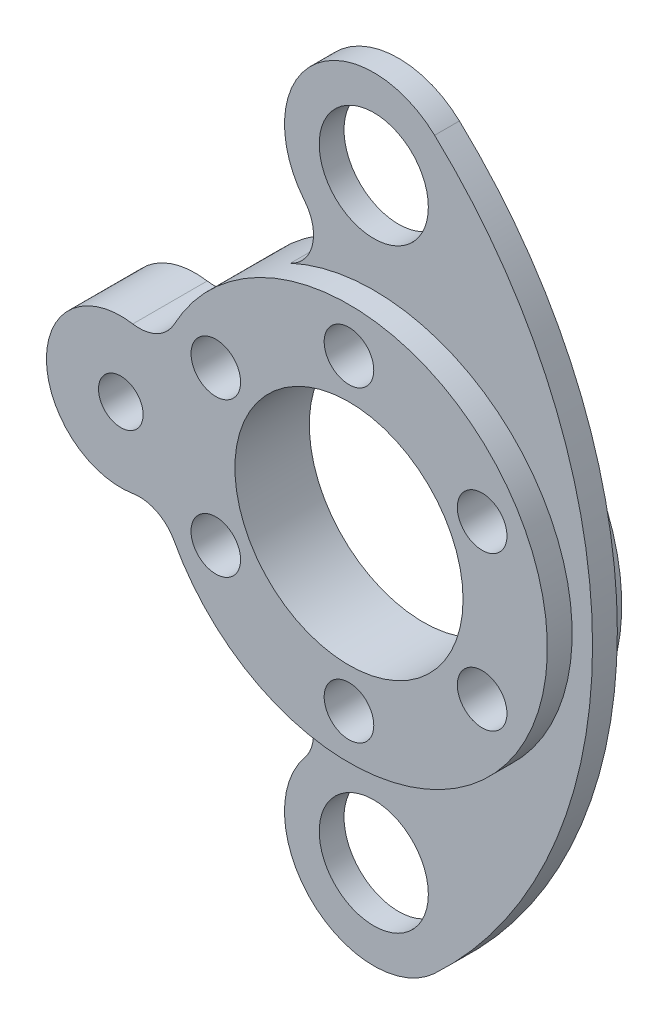
ISO-10303-21;
HEADER;
FILE_DESCRIPTION(('STEP AP214'),'2;1');
FILE_NAME('part.step','',(''),(''),'','','');
FILE_SCHEMA(('AUTOMOTIVE_DESIGN { 1 0 10303 214 1 1 1 1 }'));
ENDSEC;
DATA;
#1=APPLICATION_CONTEXT('core data for automotive mechanical design processes');
#2=APPLICATION_PROTOCOL_DEFINITION('international standard','automotive_design',2000,#1);
#3=PRODUCT_CONTEXT('',#1,'mechanical');
#4=PRODUCT('Part','Part','',(#3));
#5=PRODUCT_RELATED_PRODUCT_CATEGORY('part','',(#4));
#6=PRODUCT_DEFINITION_FORMATION('','',#4);
#7=PRODUCT_DEFINITION_CONTEXT('part definition',#1,'design');
#8=PRODUCT_DEFINITION('design','',#6,#7);
#9=PRODUCT_DEFINITION_SHAPE('','',#8);
#10=(LENGTH_UNIT() NAMED_UNIT(*) SI_UNIT(.MILLI.,.METRE.));
#11=(NAMED_UNIT(*) PLANE_ANGLE_UNIT() SI_UNIT($,.RADIAN.));
#12=(NAMED_UNIT(*) SI_UNIT($,.STERADIAN.) SOLID_ANGLE_UNIT());
#13=UNCERTAINTY_MEASURE_WITH_UNIT(LENGTH_MEASURE(1.E-05),#10,'distance_accuracy_value','');
#14=(GEOMETRIC_REPRESENTATION_CONTEXT(3) GLOBAL_UNCERTAINTY_ASSIGNED_CONTEXT((#13)) GLOBAL_UNIT_ASSIGNED_CONTEXT((#10,
#11,#12)) REPRESENTATION_CONTEXT('',''));
#15=CARTESIAN_POINT('',(0.,0.,0.));
#16=DIRECTION('',(0.,0.,1.));
#17=DIRECTION('',(1.,0.,0.));
#18=AXIS2_PLACEMENT_3D('',#15,#16,#17);
#19=CARTESIAN_POINT('',(-46.,0.,-15.));
#20=DIRECTION('',(0.,0.,1.));
#21=DIRECTION('',(1.,0.,0.));
#22=AXIS2_PLACEMENT_3D('',#19,#20,#21);
#23=CYLINDRICAL_SURFACE('',#22,15.);
#24=CARTESIAN_POINT('',(-46.,0.,0.));
#25=DIRECTION('',(0.,0.,1.));
#26=DIRECTION('',(1.,0.,0.));
#27=AXIS2_PLACEMENT_3D('',#24,#25,#26);
#28=CIRCLE('',#27,15.);
#29=CARTESIAN_POINT('',(-43.5827032136106,14.8039412403086,0.));
#30=VERTEX_POINT('',#29);
#31=CARTESIAN_POINT('',(-43.5827032136106,-14.8039412403086,0.));
#32=VERTEX_POINT('',#31);
#33=EDGE_CURVE('E242',#30,#32,#28,.T.);
#34=ORIENTED_EDGE('',*,*,#33,.F.);
#35=DIRECTION('',(0.,0.,1.));
#36=VECTOR('',#35,1.);
#37=CARTESIAN_POINT('',(-43.5827032136106,14.8039412403086,-15.));
#38=LINE('',#37,#36);
#39=CARTESIAN_POINT('',(-43.5827032136106,14.8039412403086,-15.));
#40=VERTEX_POINT('',#39);
#41=EDGE_CURVE('E11',#40,#30,#38,.T.);
#42=ORIENTED_EDGE('',*,*,#41,.F.);
#43=CARTESIAN_POINT('',(-46.,0.,-15.));
#44=DIRECTION('',(0.,0.,1.));
#45=DIRECTION('',(1.,0.,0.));
#46=AXIS2_PLACEMENT_3D('',#43,#44,#45);
#47=CIRCLE('',#46,15.);
#48=CARTESIAN_POINT('',(-43.5827032136106,-14.8039412403086,-15.));
#49=VERTEX_POINT('',#48);
#50=EDGE_CURVE('E211',#40,#49,#47,.T.);
#51=ORIENTED_EDGE('',*,*,#50,.T.);
#52=DIRECTION('',(0.,0.,1.));
#53=VECTOR('',#52,1.);
#54=CARTESIAN_POINT('',(-43.5827032136106,-14.8039412403086,-15.));
#55=LINE('',#54,#53);
#56=EDGE_CURVE('E43',#49,#32,#55,.T.);
#57=ORIENTED_EDGE('',*,*,#56,.T.);
#58=EDGE_LOOP('',(#34,#42,#51,#57));
#59=FACE_BOUND('',#58,.T.);
#60=ADVANCED_FACE('F39',(#59),#23,.T.);
#61=CARTESIAN_POINT('',(-42.2934782608696,22.6993765684733,-15.));
#62=DIRECTION('',(0.,0.,1.));
#63=DIRECTION('',(1.,0.,0.));
#64=AXIS2_PLACEMENT_3D('',#61,#62,#63);
#65=CYLINDRICAL_SURFACE('',#64,8.);
#66=CARTESIAN_POINT('',(-42.2934782608696,22.6993765684733,0.));
#67=DIRECTION('',(0.,0.,1.));
#68=DIRECTION('',(1.,0.,0.));
#69=AXIS2_PLACEMENT_3D('',#66,#67,#68);
#70=CIRCLE('',#69,8.);
#71=CARTESIAN_POINT('',(-35.2445652173913,18.9161471403944,0.));
#72=VERTEX_POINT('',#71);
#73=EDGE_CURVE('E251',#30,#72,#70,.T.);
#74=ORIENTED_EDGE('',*,*,#73,.T.);
#75=DIRECTION('',(0.,0.,1.));
#76=VECTOR('',#75,1.);
#77=CARTESIAN_POINT('',(-35.2445652173913,18.9161471403944,-15.));
#78=LINE('',#77,#76);
#79=CARTESIAN_POINT('',(-35.2445652173913,18.9161471403944,-15.));
#80=VERTEX_POINT('',#79);
#81=EDGE_CURVE('E48',#80,#72,#78,.T.);
#82=ORIENTED_EDGE('',*,*,#81,.F.);
#83=CARTESIAN_POINT('',(-42.2934782608696,22.6993765684733,-15.));
#84=DIRECTION('',(0.,0.,1.));
#85=DIRECTION('',(1.,0.,0.));
#86=AXIS2_PLACEMENT_3D('',#83,#84,#85);
#87=CIRCLE('',#86,8.);
#88=EDGE_CURVE('E217',#40,#80,#87,.T.);
#89=ORIENTED_EDGE('',*,*,#88,.F.);
#90=ORIENTED_EDGE('',*,*,#41,.T.);
#91=EDGE_LOOP('',(#74,#82,#89,#90));
#92=FACE_BOUND('',#91,.T.);
#93=ADVANCED_FACE('F270',(#92),#65,.F.);
#94=CARTESIAN_POINT('',(0.,0.,-15.));
#95=DIRECTION('',(0.,0.,1.));
#96=DIRECTION('',(1.,0.,0.));
#97=AXIS2_PLACEMENT_3D('',#94,#95,#96);
#98=CYLINDRICAL_SURFACE('',#97,40.);
#99=CARTESIAN_POINT('',(0.,0.,-5.));
#100=DIRECTION('',(0.,0.,1.));
#101=DIRECTION('',(1.,0.,0.));
#102=AXIS2_PLACEMENT_3D('',#99,#100,#101);
#103=CIRCLE('',#102,40.);
#104=CARTESIAN_POINT('',(-16.7900755150914,-36.3055555555556,-5.));
#105=VERTEX_POINT('',#104);
#106=CARTESIAN_POINT('',(-16.7900755150914,36.3055555555556,-5.));
#107=VERTEX_POINT('',#106);
#108=EDGE_CURVE('E148',#105,#107,#103,.T.);
#109=ORIENTED_EDGE('',*,*,#108,.T.);
#110=DIRECTION('',(0.,0.,-1.));
#111=VECTOR('',#110,1.);
#112=CARTESIAN_POINT('',(-16.7900755150914,36.3055555555556,-5.));
#113=LINE('',#112,#111);
#114=CARTESIAN_POINT('',(-16.7900755150914,36.3055555555556,-10.));
#115=VERTEX_POINT('',#114);
#116=EDGE_CURVE('E186',#107,#115,#113,.T.);
#117=ORIENTED_EDGE('',*,*,#116,.T.);
#118=CARTESIAN_POINT('',(0.,0.,-10.));
#119=DIRECTION('',(0.,0.,1.));
#120=DIRECTION('',(1.,0.,0.));
#121=AXIS2_PLACEMENT_3D('',#118,#119,#120);
#122=CIRCLE('',#121,40.);
#123=CARTESIAN_POINT('',(-16.7900755150914,-36.3055555555556,-10.));
#124=VERTEX_POINT('',#123);
#125=EDGE_CURVE('E181',#124,#115,#122,.T.);
#126=ORIENTED_EDGE('',*,*,#125,.F.);
#127=DIRECTION('',(0.,0.,-1.));
#128=VECTOR('',#127,1.);
#129=CARTESIAN_POINT('',(-16.7900755150914,-36.3055555555556,-5.));
#130=LINE('',#129,#128);
#131=EDGE_CURVE('E169',#105,#124,#130,.T.);
#132=ORIENTED_EDGE('',*,*,#131,.F.);
#133=EDGE_LOOP('',(#109,#117,#126,#132));
#134=FACE_BOUND('',#133,.T.);
#135=CARTESIAN_POINT('',(0.,0.,0.));
#136=DIRECTION('',(0.,0.,1.));
#137=DIRECTION('',(1.,0.,0.));
#138=AXIS2_PLACEMENT_3D('',#135,#136,#137);
#139=CIRCLE('',#138,40.);
#140=CARTESIAN_POINT('',(-35.2445652173913,-18.9161471403944,0.));
#141=VERTEX_POINT('',#140);
#142=EDGE_CURVE('E248',#141,#72,#139,.T.);
#143=ORIENTED_EDGE('',*,*,#142,.F.);
#144=DIRECTION('',(0.,0.,1.));
#145=VECTOR('',#144,1.);
#146=CARTESIAN_POINT('',(-35.2445652173913,-18.9161471403944,-15.));
#147=LINE('',#146,#145);
#148=CARTESIAN_POINT('',(-35.2445652173913,-18.9161471403944,-15.));
#149=VERTEX_POINT('',#148);
#150=EDGE_CURVE('E261',#149,#141,#147,.T.);
#151=ORIENTED_EDGE('',*,*,#150,.F.);
#152=CARTESIAN_POINT('',(0.,0.,-15.));
#153=DIRECTION('',(0.,0.,1.));
#154=DIRECTION('',(1.,0.,0.));
#155=AXIS2_PLACEMENT_3D('',#152,#153,#154);
#156=CIRCLE('',#155,40.);
#157=EDGE_CURVE('E214',#149,#80,#156,.T.);
#158=ORIENTED_EDGE('',*,*,#157,.T.);
#159=ORIENTED_EDGE('',*,*,#81,.T.);
#160=EDGE_LOOP('',(#143,#151,#158,#159));
#161=FACE_BOUND('',#160,.T.);
#162=ADVANCED_FACE('F272',(#134,#161),#98,.T.);
#163=CARTESIAN_POINT('',(0.,31.,-15.));
#164=DIRECTION('',(0.,0.,1.));
#165=DIRECTION('',(1.,0.,0.));
#166=AXIS2_PLACEMENT_3D('',#163,#164,#165);
#167=CYLINDRICAL_SURFACE('',#166,5.);
#168=CARTESIAN_POINT('',(0.,31.,-15.));
#169=DIRECTION('',(0.,0.,1.));
#170=DIRECTION('',(1.,0.,0.));
#171=AXIS2_PLACEMENT_3D('',#168,#169,#170);
#172=CIRCLE('',#171,5.);
#173=CARTESIAN_POINT('',(5.,31.,-15.));
#174=VERTEX_POINT('',#173);
#175=EDGE_CURVE('E222',#174,#174,#172,.T.);
#176=ORIENTED_EDGE('',*,*,#175,.F.);
#177=EDGE_LOOP('',(#176));
#178=FACE_BOUND('',#177,.T.);
#179=CARTESIAN_POINT('',(0.,31.,0.));
#180=DIRECTION('',(0.,0.,1.));
#181=DIRECTION('',(1.,0.,0.));
#182=AXIS2_PLACEMENT_3D('',#179,#180,#181);
#183=CIRCLE('',#182,5.);
#184=CARTESIAN_POINT('',(5.,31.,0.));
#185=VERTEX_POINT('',#184);
#186=EDGE_CURVE('E256',#185,#185,#183,.T.);
#187=ORIENTED_EDGE('',*,*,#186,.T.);
#188=EDGE_LOOP('',(#187));
#189=FACE_BOUND('',#188,.T.);
#190=ADVANCED_FACE('F374',(#178,#189),#167,.F.);
#191=CARTESIAN_POINT('',(-26.8467875173174,15.5000000000003,-15.));
#192=DIRECTION('',(0.,0.,1.));
#193=DIRECTION('',(1.,0.,0.));
#194=AXIS2_PLACEMENT_3D('',#191,#192,#193);
#195=CYLINDRICAL_SURFACE('',#194,5.);
#196=CARTESIAN_POINT('',(-26.8467875173174,15.5000000000003,-15.));
#197=DIRECTION('',(0.,0.,1.));
#198=DIRECTION('',(1.,0.,0.));
#199=AXIS2_PLACEMENT_3D('',#196,#197,#198);
#200=CIRCLE('',#199,5.);
#201=CARTESIAN_POINT('',(-21.8467875173174,15.5000000000003,-15.));
#202=VERTEX_POINT('',#201);
#203=EDGE_CURVE('E219',#202,#202,#200,.T.);
#204=ORIENTED_EDGE('',*,*,#203,.F.);
#205=EDGE_LOOP('',(#204));
#206=FACE_BOUND('',#205,.T.);
#207=CARTESIAN_POINT('',(-26.8467875173174,15.5000000000003,0.));
#208=DIRECTION('',(0.,0.,1.));
#209=DIRECTION('',(1.,0.,0.));
#210=AXIS2_PLACEMENT_3D('',#207,#208,#209);
#211=CIRCLE('',#210,5.);
#212=CARTESIAN_POINT('',(-21.8467875173174,15.5000000000003,0.));
#213=VERTEX_POINT('',#212);
#214=EDGE_CURVE('E253',#213,#213,#211,.T.);
#215=ORIENTED_EDGE('',*,*,#214,.T.);
#216=EDGE_LOOP('',(#215));
#217=FACE_BOUND('',#216,.T.);
#218=ADVANCED_FACE('F537',(#206,#217),#195,.F.);
#219=CARTESIAN_POINT('',(-42.2934782608696,-22.6993765684733,-15.));
#220=DIRECTION('',(0.,0.,1.));
#221=DIRECTION('',(1.,0.,0.));
#222=AXIS2_PLACEMENT_3D('',#219,#220,#221);
#223=CYLINDRICAL_SURFACE('',#222,8.);
#224=CARTESIAN_POINT('',(-42.2934782608696,-22.6993765684733,0.));
#225=DIRECTION('',(0.,0.,1.));
#226=DIRECTION('',(1.,0.,0.));
#227=AXIS2_PLACEMENT_3D('',#224,#225,#226);
#228=CIRCLE('',#227,8.);
#229=EDGE_CURVE('E245',#141,#32,#228,.T.);
#230=ORIENTED_EDGE('',*,*,#229,.T.);
#231=ORIENTED_EDGE('',*,*,#56,.F.);
#232=CARTESIAN_POINT('',(-42.2934782608696,-22.6993765684733,-15.));
#233=DIRECTION('',(0.,0.,1.));
#234=DIRECTION('',(1.,0.,0.));
#235=AXIS2_PLACEMENT_3D('',#232,#233,#234);
#236=CIRCLE('',#235,8.);
#237=EDGE_CURVE('E90',#149,#49,#236,.T.);
#238=ORIENTED_EDGE('',*,*,#237,.F.);
#239=ORIENTED_EDGE('',*,*,#150,.T.);
#240=EDGE_LOOP('',(#230,#231,#238,#239));
#241=FACE_BOUND('',#240,.T.);
#242=ADVANCED_FACE('F264',(#241),#223,.F.);
#243=CARTESIAN_POINT('',(-26.8467875173177,-15.4999999999997,-15.));
#244=DIRECTION('',(0.,0.,1.));
#245=DIRECTION('',(1.,0.,0.));
#246=AXIS2_PLACEMENT_3D('',#243,#244,#245);
#247=CYLINDRICAL_SURFACE('',#246,5.);
#248=CARTESIAN_POINT('',(-26.8467875173177,-15.4999999999997,-15.));
#249=DIRECTION('',(0.,0.,1.));
#250=DIRECTION('',(1.,0.,0.));
#251=AXIS2_PLACEMENT_3D('',#248,#249,#250);
#252=CIRCLE('',#251,5.);
#253=CARTESIAN_POINT('',(-21.8467875173177,-15.4999999999997,-15.));
#254=VERTEX_POINT('',#253);
#255=EDGE_CURVE('E208',#254,#254,#252,.T.);
#256=ORIENTED_EDGE('',*,*,#255,.F.);
#257=EDGE_LOOP('',(#256));
#258=FACE_BOUND('',#257,.T.);
#259=CARTESIAN_POINT('',(-26.8467875173177,-15.4999999999997,0.));
#260=DIRECTION('',(0.,0.,1.));
#261=DIRECTION('',(1.,0.,0.));
#262=AXIS2_PLACEMENT_3D('',#259,#260,#261);
#263=CIRCLE('',#262,5.);
#264=CARTESIAN_POINT('',(-21.8467875173177,-15.4999999999997,0.));
#265=VERTEX_POINT('',#264);
#266=EDGE_CURVE('E239',#265,#265,#263,.T.);
#267=ORIENTED_EDGE('',*,*,#266,.T.);
#268=EDGE_LOOP('',(#267));
#269=FACE_BOUND('',#268,.T.);
#270=ADVANCED_FACE('F308',(#258,#269),#247,.F.);
#271=CARTESIAN_POINT('',(-46.,0.,-15.));
#272=DIRECTION('',(0.,0.,1.));
#273=DIRECTION('',(1.,0.,0.));
#274=AXIS2_PLACEMENT_3D('',#271,#272,#273);
#275=CYLINDRICAL_SURFACE('',#274,4.5);
#276=CARTESIAN_POINT('',(-46.,0.,-15.));
#277=DIRECTION('',(0.,0.,1.));
#278=DIRECTION('',(1.,0.,0.));
#279=AXIS2_PLACEMENT_3D('',#276,#277,#278);
#280=CIRCLE('',#279,4.5);
#281=CARTESIAN_POINT('',(-41.5,0.,-15.));
#282=VERTEX_POINT('',#281);
#283=EDGE_CURVE('E205',#282,#282,#280,.T.);
#284=ORIENTED_EDGE('',*,*,#283,.F.);
#285=EDGE_LOOP('',(#284));
#286=FACE_BOUND('',#285,.T.);
#287=CARTESIAN_POINT('',(-46.,0.,0.));
#288=DIRECTION('',(0.,0.,1.));
#289=DIRECTION('',(1.,0.,0.));
#290=AXIS2_PLACEMENT_3D('',#287,#288,#289);
#291=CIRCLE('',#290,4.5);
#292=CARTESIAN_POINT('',(-41.5,0.,0.));
#293=VERTEX_POINT('',#292);
#294=EDGE_CURVE('E236',#293,#293,#291,.T.);
#295=ORIENTED_EDGE('',*,*,#294,.T.);
#296=EDGE_LOOP('',(#295));
#297=FACE_BOUND('',#296,.T.);
#298=ADVANCED_FACE('F311',(#286,#297),#275,.F.);
#299=CARTESIAN_POINT('',(-2.16471843008274E-13,-31.,-15.));
#300=DIRECTION('',(0.,0.,1.));
#301=DIRECTION('',(1.,0.,0.));
#302=AXIS2_PLACEMENT_3D('',#299,#300,#301);
#303=CYLINDRICAL_SURFACE('',#302,5.);
#304=CARTESIAN_POINT('',(-2.16471843008274E-13,-31.,-15.));
#305=DIRECTION('',(0.,0.,1.));
#306=DIRECTION('',(1.,0.,0.));
#307=AXIS2_PLACEMENT_3D('',#304,#305,#306);
#308=CIRCLE('',#307,5.);
#309=CARTESIAN_POINT('',(4.99999999999978,-31.,-15.));
#310=VERTEX_POINT('',#309);
#311=EDGE_CURVE('E202',#310,#310,#308,.T.);
#312=ORIENTED_EDGE('',*,*,#311,.F.);
#313=EDGE_LOOP('',(#312));
#314=FACE_BOUND('',#313,.T.);
#315=CARTESIAN_POINT('',(-2.16471843008274E-13,-31.,0.));
#316=DIRECTION('',(0.,0.,1.));
#317=DIRECTION('',(1.,0.,0.));
#318=AXIS2_PLACEMENT_3D('',#315,#316,#317);
#319=CIRCLE('',#318,5.);
#320=CARTESIAN_POINT('',(4.99999999999978,-31.,0.));
#321=VERTEX_POINT('',#320);
#322=EDGE_CURVE('E233',#321,#321,#319,.T.);
#323=ORIENTED_EDGE('',*,*,#322,.T.);
#324=EDGE_LOOP('',(#323));
#325=FACE_BOUND('',#324,.T.);
#326=ADVANCED_FACE('F315',(#314,#325),#303,.F.);
#327=CARTESIAN_POINT('',(26.8467875173175,-15.5000000000001,-15.));
#328=DIRECTION('',(0.,0.,1.));
#329=DIRECTION('',(1.,0.,0.));
#330=AXIS2_PLACEMENT_3D('',#327,#328,#329);
#331=CYLINDRICAL_SURFACE('',#330,5.);
#332=CARTESIAN_POINT('',(26.8467875173175,-15.5000000000001,-15.));
#333=DIRECTION('',(0.,0.,1.));
#334=DIRECTION('',(1.,0.,0.));
#335=AXIS2_PLACEMENT_3D('',#332,#333,#334);
#336=CIRCLE('',#335,5.);
#337=CARTESIAN_POINT('',(31.8467875173175,-15.5000000000001,-15.));
#338=VERTEX_POINT('',#337);
#339=EDGE_CURVE('E198',#338,#338,#336,.T.);
#340=ORIENTED_EDGE('',*,*,#339,.F.);
#341=EDGE_LOOP('',(#340));
#342=FACE_BOUND('',#341,.T.);
#343=CARTESIAN_POINT('',(26.8467875173175,-15.5000000000001,0.));
#344=DIRECTION('',(0.,0.,1.));
#345=DIRECTION('',(1.,0.,0.));
#346=AXIS2_PLACEMENT_3D('',#343,#344,#345);
#347=CIRCLE('',#346,5.);
#348=CARTESIAN_POINT('',(31.8467875173175,-15.5000000000001,0.));
#349=VERTEX_POINT('',#348);
#350=EDGE_CURVE('E230',#349,#349,#347,.T.);
#351=ORIENTED_EDGE('',*,*,#350,.T.);
#352=EDGE_LOOP('',(#351));
#353=FACE_BOUND('',#352,.T.);
#354=ADVANCED_FACE('F318',(#342,#353),#331,.F.);
#355=CARTESIAN_POINT('',(0.,0.,-15.));
#356=DIRECTION('',(0.,0.,1.));
#357=DIRECTION('',(1.,0.,0.));
#358=AXIS2_PLACEMENT_3D('',#355,#356,#357);
#359=CYLINDRICAL_SURFACE('',#358,23.);
#360=CARTESIAN_POINT('',(0.,0.,-15.));
#361=DIRECTION('',(0.,0.,1.));
#362=DIRECTION('',(1.,0.,0.));
#363=AXIS2_PLACEMENT_3D('',#360,#361,#362);
#364=CIRCLE('',#363,23.);
#365=CARTESIAN_POINT('',(23.,0.,-15.));
#366=VERTEX_POINT('',#365);
#367=EDGE_CURVE('E195',#366,#366,#364,.T.);
#368=ORIENTED_EDGE('',*,*,#367,.F.);
#369=EDGE_LOOP('',(#368));
#370=FACE_BOUND('',#369,.T.);
#371=CARTESIAN_POINT('',(0.,0.,0.));
#372=DIRECTION('',(0.,0.,1.));
#373=DIRECTION('',(1.,0.,0.));
#374=AXIS2_PLACEMENT_3D('',#371,#372,#373);
#375=CIRCLE('',#374,23.);
#376=CARTESIAN_POINT('',(23.,0.,0.));
#377=VERTEX_POINT('',#376);
#378=EDGE_CURVE('E133',#377,#377,#375,.T.);
#379=ORIENTED_EDGE('',*,*,#378,.T.);
#380=EDGE_LOOP('',(#379));
#381=FACE_BOUND('',#380,.T.);
#382=ADVANCED_FACE('F41',(#370,#381),#359,.F.);
#383=CARTESIAN_POINT('',(26.8467875173176,15.4999999999999,-15.));
#384=DIRECTION('',(0.,0.,1.));
#385=DIRECTION('',(1.,0.,0.));
#386=AXIS2_PLACEMENT_3D('',#383,#384,#385);
#387=CYLINDRICAL_SURFACE('',#386,5.);
#388=CARTESIAN_POINT('',(26.8467875173176,15.4999999999999,-15.));
#389=DIRECTION('',(0.,0.,1.));
#390=DIRECTION('',(1.,0.,0.));
#391=AXIS2_PLACEMENT_3D('',#388,#389,#390);
#392=CIRCLE('',#391,5.);
#393=CARTESIAN_POINT('',(31.8467875173176,15.4999999999999,-15.));
#394=VERTEX_POINT('',#393);
#395=EDGE_CURVE('E225',#394,#394,#392,.T.);
#396=ORIENTED_EDGE('',*,*,#395,.F.);
#397=EDGE_LOOP('',(#396));
#398=FACE_BOUND('',#397,.T.);
#399=CARTESIAN_POINT('',(26.8467875173176,15.4999999999999,0.));
#400=DIRECTION('',(0.,0.,1.));
#401=DIRECTION('',(1.,0.,0.));
#402=AXIS2_PLACEMENT_3D('',#399,#400,#401);
#403=CIRCLE('',#402,5.);
#404=CARTESIAN_POINT('',(31.8467875173176,15.4999999999999,0.));
#405=VERTEX_POINT('',#404);
#406=EDGE_CURVE('E199',#405,#405,#403,.T.);
#407=ORIENTED_EDGE('',*,*,#406,.T.);
#408=EDGE_LOOP('',(#407));
#409=FACE_BOUND('',#408,.T.);
#410=ADVANCED_FACE('F276',(#398,#409),#387,.F.);
#411=CARTESIAN_POINT('',(0.,0.,-15.));
#412=DIRECTION('',(0.,0.,1.));
#413=DIRECTION('',(1.,0.,0.));
#414=AXIS2_PLACEMENT_3D('',#411,#412,#413);
#415=PLANE('',#414);
#416=ORIENTED_EDGE('',*,*,#367,.T.);
#417=EDGE_LOOP('',(#416));
#418=FACE_BOUND('',#417,.T.);
#419=ORIENTED_EDGE('',*,*,#339,.T.);
#420=EDGE_LOOP('',(#419));
#421=FACE_BOUND('',#420,.T.);
#422=ORIENTED_EDGE('',*,*,#311,.T.);
#423=EDGE_LOOP('',(#422));
#424=FACE_BOUND('',#423,.T.);
#425=ORIENTED_EDGE('',*,*,#283,.T.);
#426=EDGE_LOOP('',(#425));
#427=FACE_BOUND('',#426,.T.);
#428=ORIENTED_EDGE('',*,*,#255,.T.);
#429=EDGE_LOOP('',(#428));
#430=FACE_BOUND('',#429,.T.);
#431=ORIENTED_EDGE('',*,*,#50,.F.);
#432=ORIENTED_EDGE('',*,*,#88,.T.);
#433=ORIENTED_EDGE('',*,*,#157,.F.);
#434=ORIENTED_EDGE('',*,*,#237,.T.);
#435=EDGE_LOOP('',(#431,#432,#433,#434));
#436=FACE_BOUND('',#435,.T.);
#437=ORIENTED_EDGE('',*,*,#203,.T.);
#438=EDGE_LOOP('',(#437));
#439=FACE_BOUND('',#438,.T.);
#440=ORIENTED_EDGE('',*,*,#175,.T.);
#441=EDGE_LOOP('',(#440));
#442=FACE_BOUND('',#441,.T.);
#443=ORIENTED_EDGE('',*,*,#395,.T.);
#444=EDGE_LOOP('',(#443));
#445=FACE_BOUND('',#444,.T.);
#446=ADVANCED_FACE('F273',(#418,#421,#424,#427,#430,#436,#439,#442,#445),#415,.F.);
#447=CARTESIAN_POINT('',(0.,0.,0.));
#448=DIRECTION('',(0.,0.,1.));
#449=DIRECTION('',(1.,0.,0.));
#450=AXIS2_PLACEMENT_3D('',#447,#448,#449);
#451=PLANE('',#450);
#452=ORIENTED_EDGE('',*,*,#378,.F.);
#453=EDGE_LOOP('',(#452));
#454=FACE_BOUND('',#453,.T.);
#455=ORIENTED_EDGE('',*,*,#350,.F.);
#456=EDGE_LOOP('',(#455));
#457=FACE_BOUND('',#456,.T.);
#458=ORIENTED_EDGE('',*,*,#322,.F.);
#459=EDGE_LOOP('',(#458));
#460=FACE_BOUND('',#459,.T.);
#461=ORIENTED_EDGE('',*,*,#294,.F.);
#462=EDGE_LOOP('',(#461));
#463=FACE_BOUND('',#462,.T.);
#464=ORIENTED_EDGE('',*,*,#266,.F.);
#465=EDGE_LOOP('',(#464));
#466=FACE_BOUND('',#465,.T.);
#467=ORIENTED_EDGE('',*,*,#33,.T.);
#468=ORIENTED_EDGE('',*,*,#229,.F.);
#469=ORIENTED_EDGE('',*,*,#142,.T.);
#470=ORIENTED_EDGE('',*,*,#73,.F.);
#471=EDGE_LOOP('',(#467,#468,#469,#470));
#472=FACE_BOUND('',#471,.T.);
#473=ORIENTED_EDGE('',*,*,#214,.F.);
#474=EDGE_LOOP('',(#473));
#475=FACE_BOUND('',#474,.T.);
#476=ORIENTED_EDGE('',*,*,#186,.F.);
#477=EDGE_LOOP('',(#476));
#478=FACE_BOUND('',#477,.T.);
#479=ORIENTED_EDGE('',*,*,#406,.F.);
#480=EDGE_LOOP('',(#479));
#481=FACE_BOUND('',#480,.T.);
#482=ADVANCED_FACE('F267',(#454,#457,#460,#463,#466,#472,#475,#478,#481),#451,.T.);
#483=CARTESIAN_POINT('',(-20.1480906181096,-43.5666666666667,-5.));
#484=DIRECTION('',(0.,0.,-1.));
#485=DIRECTION('',(-1.,0.,0.));
#486=AXIS2_PLACEMENT_3D('',#483,#484,#485);
#487=CYLINDRICAL_SURFACE('',#486,8.);
#488=CARTESIAN_POINT('',(-20.1480906181096,-43.5666666666667,-10.));
#489=DIRECTION('',(0.,0.,1.));
#490=DIRECTION('',(1.,0.,0.));
#491=AXIS2_PLACEMENT_3D('',#488,#489,#490);
#492=CIRCLE('',#491,8.);
#493=CARTESIAN_POINT('',(-13.9486781202298,-48.6230769230769,-10.));
#494=VERTEX_POINT('',#493);
#495=EDGE_CURVE('E56',#494,#124,#492,.T.);
#496=ORIENTED_EDGE('',*,*,#495,.F.);
#497=DIRECTION('',(0.,0.,-1.));
#498=VECTOR('',#497,1.);
#499=CARTESIAN_POINT('',(-13.9486781202298,-48.6230769230769,-5.));
#500=LINE('',#499,#498);
#501=CARTESIAN_POINT('',(-13.9486781202298,-48.6230769230769,-5.));
#502=VERTEX_POINT('',#501);
#503=EDGE_CURVE('E126',#502,#494,#500,.T.);
#504=ORIENTED_EDGE('',*,*,#503,.F.);
#505=CARTESIAN_POINT('',(-20.1480906181096,-43.5666666666667,-5.));
#506=DIRECTION('',(0.,0.,1.));
#507=DIRECTION('',(1.,0.,0.));
#508=AXIS2_PLACEMENT_3D('',#505,#506,#507);
#509=CIRCLE('',#508,8.);
#510=EDGE_CURVE('E130',#502,#105,#509,.T.);
#511=ORIENTED_EDGE('',*,*,#510,.T.);
#512=ORIENTED_EDGE('',*,*,#131,.T.);
#513=EDGE_LOOP('',(#496,#504,#511,#512));
#514=FACE_BOUND('',#513,.T.);
#515=ADVANCED_FACE('F128',(#514),#487,.F.);
#516=CARTESIAN_POINT('',(0.,-60.,-5.));
#517=DIRECTION('',(0.,0.,-1.));
#518=DIRECTION('',(-1.,0.,0.));
#519=AXIS2_PLACEMENT_3D('',#516,#517,#518);
#520=CYLINDRICAL_SURFACE('',#519,18.);
#521=CARTESIAN_POINT('',(0.,-60.,-10.));
#522=DIRECTION('',(0.,0.,1.));
#523=DIRECTION('',(1.,0.,0.));
#524=AXIS2_PLACEMENT_3D('',#521,#522,#523);
#525=CIRCLE('',#524,18.);
#526=CARTESIAN_POINT('',(12.269141220716,-73.1707317073171,-10.));
#527=VERTEX_POINT('',#526);
#528=EDGE_CURVE('E171',#494,#527,#525,.T.);
#529=ORIENTED_EDGE('',*,*,#528,.T.);
#530=DIRECTION('',(0.,0.,-1.));
#531=VECTOR('',#530,1.);
#532=CARTESIAN_POINT('',(12.269141220716,-73.1707317073171,-5.));
#533=LINE('',#532,#531);
#534=CARTESIAN_POINT('',(12.269141220716,-73.1707317073171,-5.));
#535=VERTEX_POINT('',#534);
#536=EDGE_CURVE('E134',#535,#527,#533,.T.);
#537=ORIENTED_EDGE('',*,*,#536,.F.);
#538=CARTESIAN_POINT('',(0.,-60.,-5.));
#539=DIRECTION('',(0.,0.,1.));
#540=DIRECTION('',(1.,0.,0.));
#541=AXIS2_PLACEMENT_3D('',#538,#539,#540);
#542=CIRCLE('',#541,18.);
#543=EDGE_CURVE('E137',#502,#535,#542,.T.);
#544=ORIENTED_EDGE('',*,*,#543,.F.);
#545=ORIENTED_EDGE('',*,*,#503,.T.);
#546=EDGE_LOOP('',(#529,#537,#544,#545));
#547=FACE_BOUND('',#546,.T.);
#548=ADVANCED_FACE('F138',(#547),#520,.T.);
#549=CARTESIAN_POINT('',(-55.8927544499285,0.,-5.));
#550=DIRECTION('',(0.,0.,-1.));
#551=DIRECTION('',(-1.,0.,0.));
#552=AXIS2_PLACEMENT_3D('',#549,#550,#551);
#553=CYLINDRICAL_SURFACE('',#552,100.);
#554=CARTESIAN_POINT('',(-55.8927544499285,0.,-10.));
#555=DIRECTION('',(0.,0.,1.));
#556=DIRECTION('',(1.,0.,0.));
#557=AXIS2_PLACEMENT_3D('',#554,#555,#556);
#558=CIRCLE('',#557,100.);
#559=CARTESIAN_POINT('',(12.269141220716,73.1707317073171,-10.));
#560=VERTEX_POINT('',#559);
#561=EDGE_CURVE('E173',#527,#560,#558,.T.);
#562=ORIENTED_EDGE('',*,*,#561,.T.);
#563=DIRECTION('',(0.,0.,-1.));
#564=VECTOR('',#563,1.);
#565=CARTESIAN_POINT('',(12.269141220716,73.1707317073171,-5.));
#566=LINE('',#565,#564);
#567=CARTESIAN_POINT('',(12.269141220716,73.1707317073171,-5.));
#568=VERTEX_POINT('',#567);
#569=EDGE_CURVE('E191',#568,#560,#566,.T.);
#570=ORIENTED_EDGE('',*,*,#569,.F.);
#571=CARTESIAN_POINT('',(-55.8927544499285,0.,-5.));
#572=DIRECTION('',(0.,0.,1.));
#573=DIRECTION('',(1.,0.,0.));
#574=AXIS2_PLACEMENT_3D('',#571,#572,#573);
#575=CIRCLE('',#574,100.);
#576=EDGE_CURVE('E142',#535,#568,#575,.T.);
#577=ORIENTED_EDGE('',*,*,#576,.F.);
#578=ORIENTED_EDGE('',*,*,#536,.T.);
#579=EDGE_LOOP('',(#562,#570,#577,#578));
#580=FACE_BOUND('',#579,.T.);
#581=ADVANCED_FACE('F393',(#580),#553,.T.);
#582=CARTESIAN_POINT('',(0.,60.,-5.));
#583=DIRECTION('',(0.,0.,-1.));
#584=DIRECTION('',(-1.,0.,0.));
#585=AXIS2_PLACEMENT_3D('',#582,#583,#584);
#586=CYLINDRICAL_SURFACE('',#585,18.);
#587=CARTESIAN_POINT('',(0.,60.,-10.));
#588=DIRECTION('',(0.,0.,1.));
#589=DIRECTION('',(1.,0.,0.));
#590=AXIS2_PLACEMENT_3D('',#587,#588,#589);
#591=CIRCLE('',#590,18.);
#592=CARTESIAN_POINT('',(-13.9486781202298,48.6230769230769,-10.));
#593=VERTEX_POINT('',#592);
#594=EDGE_CURVE('E175',#560,#593,#591,.T.);
#595=ORIENTED_EDGE('',*,*,#594,.T.);
#596=DIRECTION('',(0.,0.,-1.));
#597=VECTOR('',#596,1.);
#598=CARTESIAN_POINT('',(-13.9486781202298,48.6230769230769,-5.));
#599=LINE('',#598,#597);
#600=CARTESIAN_POINT('',(-13.9486781202298,48.6230769230769,-5.));
#601=VERTEX_POINT('',#600);
#602=EDGE_CURVE('E189',#601,#593,#599,.T.);
#603=ORIENTED_EDGE('',*,*,#602,.F.);
#604=CARTESIAN_POINT('',(0.,60.,-5.));
#605=DIRECTION('',(0.,0.,1.));
#606=DIRECTION('',(1.,0.,0.));
#607=AXIS2_PLACEMENT_3D('',#604,#605,#606);
#608=CIRCLE('',#607,18.);
#609=EDGE_CURVE('E157',#568,#601,#608,.T.);
#610=ORIENTED_EDGE('',*,*,#609,.F.);
#611=ORIENTED_EDGE('',*,*,#569,.T.);
#612=EDGE_LOOP('',(#595,#603,#610,#611));
#613=FACE_BOUND('',#612,.T.);
#614=ADVANCED_FACE('F403',(#613),#586,.T.);
#615=CARTESIAN_POINT('',(-20.1480906181096,43.5666666666667,-5.));
#616=DIRECTION('',(0.,0.,-1.));
#617=DIRECTION('',(-1.,0.,0.));
#618=AXIS2_PLACEMENT_3D('',#615,#616,#617);
#619=CYLINDRICAL_SURFACE('',#618,8.);
#620=CARTESIAN_POINT('',(-20.1480906181096,43.5666666666667,-10.));
#621=DIRECTION('',(0.,0.,1.));
#622=DIRECTION('',(1.,0.,0.));
#623=AXIS2_PLACEMENT_3D('',#620,#621,#622);
#624=CIRCLE('',#623,8.);
#625=EDGE_CURVE('E178',#115,#593,#624,.T.);
#626=ORIENTED_EDGE('',*,*,#625,.F.);
#627=ORIENTED_EDGE('',*,*,#116,.F.);
#628=CARTESIAN_POINT('',(-20.1480906181096,43.5666666666667,-5.));
#629=DIRECTION('',(0.,0.,1.));
#630=DIRECTION('',(1.,0.,0.));
#631=AXIS2_PLACEMENT_3D('',#628,#629,#630);
#632=CIRCLE('',#631,8.);
#633=EDGE_CURVE('E159',#107,#601,#632,.T.);
#634=ORIENTED_EDGE('',*,*,#633,.T.);
#635=ORIENTED_EDGE('',*,*,#602,.T.);
#636=EDGE_LOOP('',(#626,#627,#634,#635));
#637=FACE_BOUND('',#636,.T.);
#638=ADVANCED_FACE('F414',(#637),#619,.F.);
#639=CARTESIAN_POINT('',(0.,60.,-5.));
#640=DIRECTION('',(0.,0.,-1.));
#641=DIRECTION('',(-1.,0.,0.));
#642=AXIS2_PLACEMENT_3D('',#639,#640,#641);
#643=CYLINDRICAL_SURFACE('',#642,11.);
#644=CARTESIAN_POINT('',(0.,60.,-5.));
#645=DIRECTION('',(0.,0.,1.));
#646=DIRECTION('',(1.,0.,0.));
#647=AXIS2_PLACEMENT_3D('',#644,#645,#646);
#648=CIRCLE('',#647,11.);
#649=CARTESIAN_POINT('',(10.9999999999999,60.,-5.));
#650=VERTEX_POINT('',#649);
#651=EDGE_CURVE('E163',#650,#650,#648,.T.);
#652=ORIENTED_EDGE('',*,*,#651,.T.);
#653=EDGE_LOOP('',(#652));
#654=FACE_BOUND('',#653,.T.);
#655=CARTESIAN_POINT('',(0.,60.,-10.));
#656=DIRECTION('',(0.,0.,1.));
#657=DIRECTION('',(1.,0.,0.));
#658=AXIS2_PLACEMENT_3D('',#655,#656,#657);
#659=CIRCLE('',#658,11.);
#660=CARTESIAN_POINT('',(10.9999999999999,60.,-10.));
#661=VERTEX_POINT('',#660);
#662=EDGE_CURVE('E153',#661,#661,#659,.T.);
#663=ORIENTED_EDGE('',*,*,#662,.F.);
#664=EDGE_LOOP('',(#663));
#665=FACE_BOUND('',#664,.T.);
#666=ADVANCED_FACE('F425',(#654,#665),#643,.F.);
#667=CARTESIAN_POINT('',(0.,-60.,-5.));
#668=DIRECTION('',(0.,0.,-1.));
#669=DIRECTION('',(-1.,0.,0.));
#670=AXIS2_PLACEMENT_3D('',#667,#668,#669);
#671=CYLINDRICAL_SURFACE('',#670,11.);
#672=CARTESIAN_POINT('',(0.,-60.,-5.));
#673=DIRECTION('',(0.,0.,1.));
#674=DIRECTION('',(1.,0.,0.));
#675=AXIS2_PLACEMENT_3D('',#672,#673,#674);
#676=CIRCLE('',#675,11.);
#677=CARTESIAN_POINT('',(10.9999999999999,-60.,-5.));
#678=VERTEX_POINT('',#677);
#679=EDGE_CURVE('E166',#678,#678,#676,.T.);
#680=ORIENTED_EDGE('',*,*,#679,.T.);
#681=EDGE_LOOP('',(#680));
#682=FACE_BOUND('',#681,.T.);
#683=CARTESIAN_POINT('',(0.,-60.,-10.));
#684=DIRECTION('',(0.,0.,1.));
#685=DIRECTION('',(1.,0.,0.));
#686=AXIS2_PLACEMENT_3D('',#683,#684,#685);
#687=CIRCLE('',#686,11.);
#688=CARTESIAN_POINT('',(10.9999999999999,-60.,-10.));
#689=VERTEX_POINT('',#688);
#690=EDGE_CURVE('E150',#689,#689,#687,.T.);
#691=ORIENTED_EDGE('',*,*,#690,.F.);
#692=EDGE_LOOP('',(#691));
#693=FACE_BOUND('',#692,.T.);
#694=ADVANCED_FACE('F436',(#682,#693),#671,.F.);
#695=CARTESIAN_POINT('',(0.,0.,-5.));
#696=DIRECTION('',(0.,0.,1.));
#697=DIRECTION('',(1.,0.,0.));
#698=AXIS2_PLACEMENT_3D('',#695,#696,#697);
#699=PLANE('',#698);
#700=ORIENTED_EDGE('',*,*,#510,.F.);
#701=ORIENTED_EDGE('',*,*,#543,.T.);
#702=ORIENTED_EDGE('',*,*,#576,.T.);
#703=ORIENTED_EDGE('',*,*,#609,.T.);
#704=ORIENTED_EDGE('',*,*,#633,.F.);
#705=ORIENTED_EDGE('',*,*,#108,.F.);
#706=EDGE_LOOP('',(#700,#701,#702,#703,#704,#705));
#707=FACE_BOUND('',#706,.T.);
#708=ORIENTED_EDGE('',*,*,#651,.F.);
#709=EDGE_LOOP('',(#708));
#710=FACE_BOUND('',#709,.T.);
#711=ORIENTED_EDGE('',*,*,#679,.F.);
#712=EDGE_LOOP('',(#711));
#713=FACE_BOUND('',#712,.T.);
#714=ADVANCED_FACE('F144',(#707,#710,#713),#699,.T.);
#715=CARTESIAN_POINT('',(0.,0.,-10.));
#716=DIRECTION('',(0.,0.,1.));
#717=DIRECTION('',(1.,0.,0.));
#718=AXIS2_PLACEMENT_3D('',#715,#716,#717);
#719=PLANE('',#718);
#720=ORIENTED_EDGE('',*,*,#495,.T.);
#721=ORIENTED_EDGE('',*,*,#125,.T.);
#722=ORIENTED_EDGE('',*,*,#625,.T.);
#723=ORIENTED_EDGE('',*,*,#594,.F.);
#724=ORIENTED_EDGE('',*,*,#561,.F.);
#725=ORIENTED_EDGE('',*,*,#528,.F.);
#726=EDGE_LOOP('',(#720,#721,#722,#723,#724,#725));
#727=FACE_BOUND('',#726,.T.);
#728=ORIENTED_EDGE('',*,*,#662,.T.);
#729=EDGE_LOOP('',(#728));
#730=FACE_BOUND('',#729,.T.);
#731=ORIENTED_EDGE('',*,*,#690,.T.);
#732=EDGE_LOOP('',(#731));
#733=FACE_BOUND('',#732,.T.);
#734=ADVANCED_FACE('F458',(#727,#730,#733),#719,.F.);
#735=CLOSED_SHELL('',(#60,#93,#162,#190,#218,#242,#270,#298,#326,#354,#382,#410,#446,#482,#515,
#548,#581,#614,#638,#666,#694,#714,#734));
#736=MANIFOLD_SOLID_BREP('B2',#735);
#737=ADVANCED_BREP_SHAPE_REPRESENTATION('',(#18,#736),#14);
#738=SHAPE_DEFINITION_REPRESENTATION(#9,#737);
ENDSEC;
END-ISO-10303-21;
